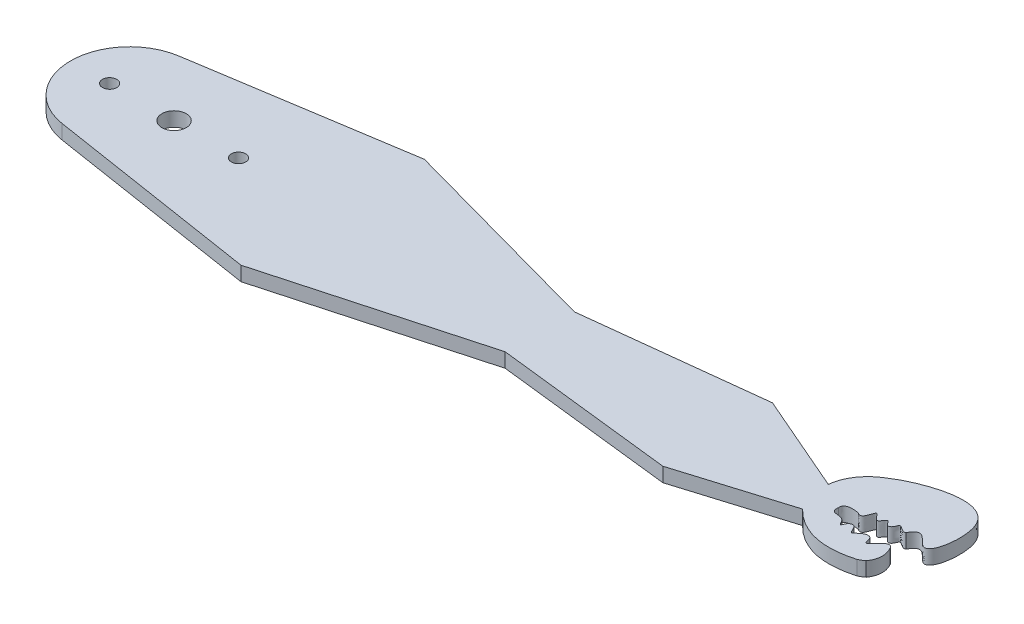
ISO-10303-21;
HEADER;
FILE_DESCRIPTION(('STEP AP214'),'2;1');
FILE_NAME('part.step','',(''),(''),'','','');
FILE_SCHEMA(('AUTOMOTIVE_DESIGN { 1 0 10303 214 1 1 1 1 }'));
ENDSEC;
DATA;
#1=APPLICATION_CONTEXT('core data for automotive mechanical design processes');
#2=APPLICATION_PROTOCOL_DEFINITION('international standard','automotive_design',2000,#1);
#3=PRODUCT_CONTEXT('',#1,'mechanical');
#4=PRODUCT('Part','Part','',(#3));
#5=PRODUCT_RELATED_PRODUCT_CATEGORY('part','',(#4));
#6=PRODUCT_DEFINITION_FORMATION('','',#4);
#7=PRODUCT_DEFINITION_CONTEXT('part definition',#1,'design');
#8=PRODUCT_DEFINITION('design','',#6,#7);
#9=PRODUCT_DEFINITION_SHAPE('','',#8);
#10=(LENGTH_UNIT() NAMED_UNIT(*) SI_UNIT(.MILLI.,.METRE.));
#11=(NAMED_UNIT(*) PLANE_ANGLE_UNIT() SI_UNIT($,.RADIAN.));
#12=(NAMED_UNIT(*) SI_UNIT($,.STERADIAN.) SOLID_ANGLE_UNIT());
#13=UNCERTAINTY_MEASURE_WITH_UNIT(LENGTH_MEASURE(1.E-05),#10,'distance_accuracy_value','');
#14=(GEOMETRIC_REPRESENTATION_CONTEXT(3) GLOBAL_UNCERTAINTY_ASSIGNED_CONTEXT((#13)) GLOBAL_UNIT_ASSIGNED_CONTEXT((#10,
#11,#12)) REPRESENTATION_CONTEXT('',''));
#15=CARTESIAN_POINT('',(0.,0.,0.));
#16=DIRECTION('',(0.,0.,1.));
#17=DIRECTION('',(1.,0.,0.));
#18=AXIS2_PLACEMENT_3D('',#15,#16,#17);
#19=CARTESIAN_POINT('',(-348.757842153945,2.,3.37769699555757E-05));
#20=DIRECTION('',(0.,-1.,0.));
#21=DIRECTION('',(0.,0.,-1.));
#22=AXIS2_PLACEMENT_3D('',#19,#20,#21);
#23=PLANE('',#22);
#24=DIRECTION('',(-0.987925316816776,0.,0.154930850357418));
#25=VECTOR('',#24,1.);
#26=CARTESIAN_POINT('',(-320.399473127503,2.,-12.8060343484789));
#27=LINE('',#26,#25);
#28=CARTESIAN_POINT('',(-320.399473127503,2.,-12.8060343484789));
#29=VERTEX_POINT('',#28);
#30=CARTESIAN_POINT('',(-350.037238292093,2.,-8.15810795011669));
#31=VERTEX_POINT('',#30);
#32=EDGE_CURVE('E289',#29,#31,#27,.T.);
#33=ORIENTED_EDGE('',*,*,#32,.T.);
#34=CARTESIAN_POINT('',(-348.757842153945,2.,3.37769699555757E-05));
#35=DIRECTION('',(0.,1.,0.));
#36=DIRECTION('',(0.,0.,-1.));
#37=AXIS2_PLACEMENT_3D('',#34,#35,#36);
#38=CIRCLE('',#37,8.25785268199552);
#39=CARTESIAN_POINT('',(-350.037238295601,2.,8.158175503507));
#40=VERTEX_POINT('',#39);
#41=EDGE_CURVE('E131',#31,#40,#38,.T.);
#42=ORIENTED_EDGE('',*,*,#41,.T.);
#43=DIRECTION('',(0.987925316750166,0.,0.154930850782159));
#44=VECTOR('',#43,1.);
#45=CARTESIAN_POINT('',(-320.399451417004,2.,12.8061053202124));
#46=LINE('',#45,#44);
#47=CARTESIAN_POINT('',(-320.399451417004,2.,12.8061053202124));
#48=VERTEX_POINT('',#47);
#49=EDGE_CURVE('E346',#40,#48,#46,.T.);
#50=ORIENTED_EDGE('',*,*,#49,.T.);
#51=DIRECTION('',(0.964004919808415,0.,-0.265884400793223));
#52=VECTOR('',#51,1.);
#53=CARTESIAN_POINT('',(-320.399451417004,2.,12.8061053202124));
#54=LINE('',#53,#52);
#55=CARTESIAN_POINT('',(-291.479303822752,2.,4.82957329641572));
#56=VERTEX_POINT('',#55);
#57=EDGE_CURVE('E366',#48,#56,#54,.T.);
#58=ORIENTED_EDGE('',*,*,#57,.T.);
#59=DIRECTION('',(0.993571298409724,0.,0.113208104729366));
#60=VECTOR('',#59,1.);
#61=CARTESIAN_POINT('',(-291.479303822752,2.,4.82957329641572));
#62=LINE('',#61,#60);
#63=CARTESIAN_POINT('',(-266.640021362509,2.,7.65977591464987));
#64=VERTEX_POINT('',#63);
#65=EDGE_CURVE('E362',#56,#64,#62,.T.);
#66=ORIENTED_EDGE('',*,*,#65,.T.);
#67=DIRECTION('',(0.956276851071863,0.,-0.292462961935494));
#68=VECTOR('',#67,1.);
#69=CARTESIAN_POINT('',(-266.640021362509,2.,7.65977591464987));
#70=LINE('',#69,#68);
#71=CARTESIAN_POINT('',(-251.696075381663,2.,3.0893937082174));
#72=VERTEX_POINT('',#71);
#73=EDGE_CURVE('E365',#64,#72,#70,.T.);
#74=ORIENTED_EDGE('',*,*,#73,.T.);
#75=CARTESIAN_POINT('',(-251.696075381663,2.,3.0893937082174));
#76=CARTESIAN_POINT('',(-249.084673797282,2.,5.74956122092215));
#77=CARTESIAN_POINT('',(-245.793192426089,2.,6.51151581306675));
#78=CARTESIAN_POINT('',(-241.821631268076,2.,5.3752574846623));
#79=B_SPLINE_CURVE_WITH_KNOTS('',3,(#75,#76,#77,#78),.UNSPECIFIED.,.F.,.F.,(4,4),
(0.135882265254511,1.),.UNSPECIFIED.);
#80=CARTESIAN_POINT('',(-241.821631268076,2.,5.3752574846623));
#81=VERTEX_POINT('',#80);
#82=EDGE_CURVE('E370',#72,#81,#79,.T.);
#83=ORIENTED_EDGE('',*,*,#82,.T.);
#84=CARTESIAN_POINT('',(-241.821631268076,2.,5.3752574846623));
#85=CARTESIAN_POINT('',(-241.643156571101,2.,5.30938942275893));
#86=CARTESIAN_POINT('',(-241.312545454973,2.,5.12610139004425));
#87=CARTESIAN_POINT('',(-240.997103543056,2.,4.89134270831965));
#88=B_SPLINE_CURVE_WITH_KNOTS('',3,(#84,#85,#86,#87),.UNSPECIFIED.,.F.,.F.,(4,4),(0.,
0.02362828678923),.UNSPECIFIED.);
#89=CARTESIAN_POINT('',(-240.997103543056,2.,4.89134270831965));
#90=VERTEX_POINT('',#89);
#91=EDGE_CURVE('E380',#81,#90,#88,.T.);
#92=ORIENTED_EDGE('',*,*,#91,.T.);
#93=CARTESIAN_POINT('',(-240.997103543056,2.,4.89134270831965));
#94=CARTESIAN_POINT('',(-239.966931466718,2.,3.3919956546017));
#95=CARTESIAN_POINT('',(-240.807899842543,2.,1.80035497286702));
#96=B_SPLINE_CURVE_WITH_KNOTS('',2,(#93,#94,#95),.UNSPECIFIED.,.F.,.F.,(3,3),(0.,1.),.UNSPECIFIED.);
#97=CARTESIAN_POINT('',(-240.807899842543,2.,1.80035497286702));
#98=VERTEX_POINT('',#97);
#99=EDGE_CURVE('E483',#90,#98,#96,.T.);
#100=ORIENTED_EDGE('',*,*,#99,.T.);
#101=CARTESIAN_POINT('',(-240.807899842543,2.,1.80035497286702));
#102=CARTESIAN_POINT('',(-241.169388438192,2.,0.960781139971008));
#103=CARTESIAN_POINT('',(-242.224201897098,2.,1.79730105291746));
#104=CARTESIAN_POINT('',(-243.326864122491,2.,3.26250414115986));
#105=CARTESIAN_POINT('',(-243.355713317097,2.,1.41657102157932));
#106=CARTESIAN_POINT('',(-244.720985899886,2.,1.80283182974819));
#107=CARTESIAN_POINT('',(-245.566979662435,2.,2.99073808183036));
#108=CARTESIAN_POINT('',(-245.789823544608,2.,1.29216414937665));
#109=CARTESIAN_POINT('',(-246.900381914562,2.,1.54538714498599));
#110=CARTESIAN_POINT('',(-247.112423771091,2.,2.73891734044677));
#111=CARTESIAN_POINT('',(-247.835383275373,2.,0.67903752686017));
#112=CARTESIAN_POINT('',(-249.515917865718,2.,1.8046076814795));
#113=CARTESIAN_POINT('',(-249.357187857252,2.,0.418676387322684));
#114=B_SPLINE_CURVE_WITH_KNOTS('',3,(#101,#102,#103,#104,#105,#106,#107,#108,#109,#110,#111,
#112,#113),.UNSPECIFIED.,.F.,.F.,(4,1,1,1,1,1,1,1,1,1,4),(0.,0.123556648661189,
0.228196390921648,0.303500384813847,0.412774636713077,0.476101668210691,0.57889698132745,
0.637988069442556,0.69972640040586,0.766366397499155,0.967687022896239),.UNSPECIFIED.);
#115=CARTESIAN_POINT('',(-249.357187857252,2.,0.418676387322684));
#116=VERTEX_POINT('',#115);
#117=EDGE_CURVE('E478',#98,#116,#114,.T.);
#118=ORIENTED_EDGE('',*,*,#117,.T.);
#119=CARTESIAN_POINT('',(-249.357187857252,2.,0.418676387322684));
#120=CARTESIAN_POINT('',(-249.530180599727,2.,-0.685883331463889));
#121=CARTESIAN_POINT('',(-247.707130946464,2.,-0.437949002432994));
#122=CARTESIAN_POINT('',(-247.311242473336,2.,-0.323468446235829));
#123=B_SPLINE_CURVE_WITH_KNOTS('',3,(#119,#120,#121,#122),.UNSPECIFIED.,.F.,.F.,(4,4),(0.,1.),.UNSPECIFIED.);
#124=CARTESIAN_POINT('',(-247.311242473336,2.,-0.323468446235828));
#125=VERTEX_POINT('',#124);
#126=EDGE_CURVE('E458',#116,#125,#123,.T.);
#127=ORIENTED_EDGE('',*,*,#126,.T.);
#128=CARTESIAN_POINT('',(-247.311242473336,2.,-0.323468446235828));
#129=CARTESIAN_POINT('',(-246.33439805527,2.,0.367123123334603));
#130=CARTESIAN_POINT('',(-246.354001067211,2.,-2.86824148141712));
#131=CARTESIAN_POINT('',(-245.089398938824,2.,-0.00407196348444178));
#132=CARTESIAN_POINT('',(-244.368676704118,2.,-2.04976444702337));
#133=CARTESIAN_POINT('',(-243.857318798616,2.,-0.571314740493384));
#134=CARTESIAN_POINT('',(-243.120868983887,2.,-1.09831473240628));
#135=CARTESIAN_POINT('',(-242.951073850223,2.,-2.14130011409426));
#136=CARTESIAN_POINT('',(-242.133814553318,2.,-1.11688843770171));
#137=CARTESIAN_POINT('',(-241.681380628757,2.,-1.24551456300629));
#138=CARTESIAN_POINT('',(-241.615045555612,2.,-1.27908511046874));
#139=B_SPLINE_CURVE_WITH_KNOTS('',3,(#128,#129,#130,#131,#132,#133,#134,#135,#136,#137,#138),
.UNSPECIFIED.,.F.,.F.,(4,1,1,1,1,1,1,1,4),(0.107490650731327,0.340171363528712,
0.480072762173064,0.596176515719199,0.698135384077689,0.764647112317775,0.837905578505877,
0.975006853942119,1.),.UNSPECIFIED.);
#140=CARTESIAN_POINT('',(-241.615045555612,2.,-1.27908511046874));
#141=VERTEX_POINT('',#140);
#142=EDGE_CURVE('E449',#125,#141,#139,.T.);
#143=ORIENTED_EDGE('',*,*,#142,.T.);
#144=CARTESIAN_POINT('',(-241.615045555612,2.,-1.27908511046874));
#145=CARTESIAN_POINT('',(-240.590240104387,2.,-3.34662219537973));
#146=CARTESIAN_POINT('',(-237.822398044967,2.,2.3526088443084));
#147=CARTESIAN_POINT('',(-235.338143074844,2.,-13.1849179381452));
#148=CARTESIAN_POINT('',(-247.192125326679,2.,-8.12223832573433));
#149=CARTESIAN_POINT('',(-249.182494927322,2.,-6.76830173694541));
#150=B_SPLINE_CURVE_WITH_KNOTS('',3,(#144,#145,#146,#147,#148,#149),.UNSPECIFIED.,.F.,.F.,(4,1,
1,4),(0.,0.159611963497581,0.435185754589667,1.),.UNSPECIFIED.);
#151=CARTESIAN_POINT('',(-249.182494927322,2.,-6.76830173694541));
#152=VERTEX_POINT('',#151);
#153=EDGE_CURVE('E440',#141,#152,#150,.T.);
#154=ORIENTED_EDGE('',*,*,#153,.T.);
#155=CARTESIAN_POINT('',(-249.182494927322,2.,-6.76830173694541));
#156=CARTESIAN_POINT('',(-251.139887534253,2.,-5.73572436099527));
#157=CARTESIAN_POINT('',(-252.664865396327,2.,-3.89659952658695));
#158=CARTESIAN_POINT('',(-252.877551864102,2.,-1.69364795863478));
#159=B_SPLINE_CURVE_WITH_KNOTS('',3,(#155,#156,#157,#158),.UNSPECIFIED.,.F.,.F.,(4,4),(0.,
0.432417622118642),.UNSPECIFIED.);
#160=CARTESIAN_POINT('',(-252.877551864102,2.,-1.69364795863478));
#161=VERTEX_POINT('',#160);
#162=EDGE_CURVE('E177',#152,#161,#159,.T.);
#163=ORIENTED_EDGE('',*,*,#162,.T.);
#164=DIRECTION('',(-0.917499414074508,0.,-0.397737130744584));
#165=VECTOR('',#164,1.);
#166=CARTESIAN_POINT('',(-266.64004307522,2.,-7.65970491980361));
#167=LINE('',#166,#165);
#168=CARTESIAN_POINT('',(-266.64004307522,2.,-7.65970491980361));
#169=VERTEX_POINT('',#168);
#170=EDGE_CURVE('E171',#161,#169,#167,.T.);
#171=ORIENTED_EDGE('',*,*,#170,.T.);
#172=DIRECTION('',(-0.993571298458396,0.,0.113208104302201));
#173=VECTOR('',#172,1.);
#174=CARTESIAN_POINT('',(-291.47932553668,2.,-4.82950231224858));
#175=LINE('',#174,#173);
#176=CARTESIAN_POINT('',(-291.47932553668,2.,-4.82950231224858));
#177=VERTEX_POINT('',#176);
#178=EDGE_CURVE('E175',#169,#177,#175,.T.);
#179=ORIENTED_EDGE('',*,*,#178,.T.);
#180=DIRECTION('',(-0.964004919694104,0.,-0.265884401207677));
#181=VECTOR('',#180,1.);
#182=CARTESIAN_POINT('',(-320.399473127503,2.,-12.8060343484789));
#183=LINE('',#182,#181);
#184=EDGE_CURVE('E61',#177,#29,#183,.T.);
#185=ORIENTED_EDGE('',*,*,#184,.T.);
#186=EDGE_LOOP('',(#33,#42,#50,#58,#66,#74,#83,#92,#100,#118,#127,#143,#154,#163,#171,#179,#185));
#187=FACE_BOUND('',#186,.T.);
#188=CARTESIAN_POINT('',(-351.550226025643,2.,0.));
#189=DIRECTION('',(0.,1.,0.));
#190=DIRECTION('',(0.,0.,1.));
#191=AXIS2_PLACEMENT_3D('',#188,#189,#190);
#192=CIRCLE('',#191,0.999999999999998);
#193=CARTESIAN_POINT('',(-351.550226025643,2.,0.999999999999998));
#194=VERTEX_POINT('',#193);
#195=EDGE_CURVE('E204',#194,#194,#192,.T.);
#196=ORIENTED_EDGE('',*,*,#195,.F.);
#197=EDGE_LOOP('',(#196));
#198=FACE_BOUND('',#197,.T.);
#199=CARTESIAN_POINT('',(-342.550226025643,2.,0.));
#200=DIRECTION('',(0.,1.,0.));
#201=DIRECTION('',(0.,0.,1.));
#202=AXIS2_PLACEMENT_3D('',#199,#200,#201);
#203=CIRCLE('',#202,1.69999999999996);
#204=CARTESIAN_POINT('',(-342.550226025643,2.,1.69999999999996));
#205=VERTEX_POINT('',#204);
#206=EDGE_CURVE('E532',#205,#205,#203,.T.);
#207=ORIENTED_EDGE('',*,*,#206,.F.);
#208=EDGE_LOOP('',(#207));
#209=FACE_BOUND('',#208,.T.);
#210=CARTESIAN_POINT('',(-333.550226025643,2.,0.));
#211=DIRECTION('',(0.,1.,0.));
#212=DIRECTION('',(0.,0.,-1.));
#213=AXIS2_PLACEMENT_3D('',#210,#211,#212);
#214=CIRCLE('',#213,0.999999999999998);
#215=CARTESIAN_POINT('',(-333.550226025643,2.,-0.999999999999998));
#216=VERTEX_POINT('',#215);
#217=EDGE_CURVE('E540',#216,#216,#214,.T.);
#218=ORIENTED_EDGE('',*,*,#217,.F.);
#219=EDGE_LOOP('',(#218));
#220=FACE_BOUND('',#219,.T.);
#221=ADVANCED_FACE('F43',(#187,#198,#209,#220),#23,.F.);
#222=CARTESIAN_POINT('',(-348.757842153945,0.,3.37769699555757E-05));
#223=DIRECTION('',(0.,-1.,0.));
#224=DIRECTION('',(0.,0.,-1.));
#225=AXIS2_PLACEMENT_3D('',#222,#223,#224);
#226=PLANE('',#225);
#227=CARTESIAN_POINT('',(-342.550226025643,0.,0.));
#228=DIRECTION('',(0.,1.,0.));
#229=DIRECTION('',(0.,0.,1.));
#230=AXIS2_PLACEMENT_3D('',#227,#228,#229);
#231=CIRCLE('',#230,1.69999999999996);
#232=CARTESIAN_POINT('',(-342.550226025643,0.,1.69999999999996));
#233=VERTEX_POINT('',#232);
#234=EDGE_CURVE('E536',#233,#233,#231,.T.);
#235=ORIENTED_EDGE('',*,*,#234,.T.);
#236=EDGE_LOOP('',(#235));
#237=FACE_BOUND('',#236,.T.);
#238=DIRECTION('',(-0.987925316816776,0.,0.154930850357418));
#239=VECTOR('',#238,1.);
#240=CARTESIAN_POINT('',(-320.399473127503,0.,-12.8060343484789));
#241=LINE('',#240,#239);
#242=CARTESIAN_POINT('',(-320.399473127503,0.,-12.8060343484789));
#243=VERTEX_POINT('',#242);
#244=CARTESIAN_POINT('',(-350.037238292093,0.,-8.15810795011669));
#245=VERTEX_POINT('',#244);
#246=EDGE_CURVE('E199',#243,#245,#241,.T.);
#247=ORIENTED_EDGE('',*,*,#246,.F.);
#248=DIRECTION('',(-0.964004919694104,0.,-0.265884401207677));
#249=VECTOR('',#248,1.);
#250=CARTESIAN_POINT('',(-320.399473127503,0.,-12.8060343484789));
#251=LINE('',#250,#249);
#252=CARTESIAN_POINT('',(-291.47932553668,0.,-4.82950231224858));
#253=VERTEX_POINT('',#252);
#254=EDGE_CURVE('E123',#253,#243,#251,.T.);
#255=ORIENTED_EDGE('',*,*,#254,.F.);
#256=DIRECTION('',(-0.993571298458396,0.,0.113208104302201));
#257=VECTOR('',#256,1.);
#258=CARTESIAN_POINT('',(-291.47932553668,0.,-4.82950231224858));
#259=LINE('',#258,#257);
#260=CARTESIAN_POINT('',(-266.64004307522,0.,-7.65970491980361));
#261=VERTEX_POINT('',#260);
#262=EDGE_CURVE('E117',#261,#253,#259,.T.);
#263=ORIENTED_EDGE('',*,*,#262,.F.);
#264=DIRECTION('',(-0.917499414074508,0.,-0.397737130744584));
#265=VECTOR('',#264,1.);
#266=CARTESIAN_POINT('',(-266.64004307522,0.,-7.65970491980361));
#267=LINE('',#266,#265);
#268=CARTESIAN_POINT('',(-252.877551864102,0.,-1.69364795863478));
#269=VERTEX_POINT('',#268);
#270=EDGE_CURVE('E186',#269,#261,#267,.T.);
#271=ORIENTED_EDGE('',*,*,#270,.F.);
#272=CARTESIAN_POINT('',(-249.182494927322,0.,-6.76830173694541));
#273=CARTESIAN_POINT('',(-251.139887534253,0.,-5.73572436099527));
#274=CARTESIAN_POINT('',(-252.664865396327,0.,-3.89659952658695));
#275=CARTESIAN_POINT('',(-252.877551864102,0.,-1.69364795863478));
#276=B_SPLINE_CURVE_WITH_KNOTS('',3,(#272,#273,#274,#275),.UNSPECIFIED.,.F.,.F.,(4,4),(0.,
0.432417622118642),.UNSPECIFIED.);
#277=CARTESIAN_POINT('',(-249.182494927322,0.,-6.76830173694541));
#278=VERTEX_POINT('',#277);
#279=EDGE_CURVE('E272',#278,#269,#276,.T.);
#280=ORIENTED_EDGE('',*,*,#279,.F.);
#281=CARTESIAN_POINT('',(-241.615045555612,0.,-1.27908511046874));
#282=CARTESIAN_POINT('',(-240.590240104387,0.,-3.34662219537973));
#283=CARTESIAN_POINT('',(-237.822398044967,0.,2.3526088443084));
#284=CARTESIAN_POINT('',(-235.338143074844,0.,-13.1849179381452));
#285=CARTESIAN_POINT('',(-247.192125326679,0.,-8.12223832573433));
#286=CARTESIAN_POINT('',(-249.182494927322,0.,-6.76830173694541));
#287=B_SPLINE_CURVE_WITH_KNOTS('',3,(#281,#282,#283,#284,#285,#286),.UNSPECIFIED.,.F.,.F.,(4,1,
1,4),(0.,0.159611963497581,0.435185754589667,1.),.UNSPECIFIED.);
#288=CARTESIAN_POINT('',(-241.615045555612,0.,-1.27908511046874));
#289=VERTEX_POINT('',#288);
#290=EDGE_CURVE('E264',#289,#278,#287,.T.);
#291=ORIENTED_EDGE('',*,*,#290,.F.);
#292=CARTESIAN_POINT('',(-247.311242473336,0.,-0.323468446235828));
#293=CARTESIAN_POINT('',(-246.33439805527,0.,0.367123123334603));
#294=CARTESIAN_POINT('',(-246.354001067211,0.,-2.86824148141712));
#295=CARTESIAN_POINT('',(-245.089398938824,0.,-0.00407196348444178));
#296=CARTESIAN_POINT('',(-244.368676704118,0.,-2.04976444702337));
#297=CARTESIAN_POINT('',(-243.857318798616,0.,-0.571314740493384));
#298=CARTESIAN_POINT('',(-243.120868983887,0.,-1.09831473240628));
#299=CARTESIAN_POINT('',(-242.951073850223,0.,-2.14130011409426));
#300=CARTESIAN_POINT('',(-242.133814553318,0.,-1.11688843770171));
#301=CARTESIAN_POINT('',(-241.681380628757,0.,-1.24551456300629));
#302=CARTESIAN_POINT('',(-241.615045555612,0.,-1.27908511046874));
#303=B_SPLINE_CURVE_WITH_KNOTS('',3,(#292,#293,#294,#295,#296,#297,#298,#299,#300,#301,#302),
.UNSPECIFIED.,.F.,.F.,(4,1,1,1,1,1,1,1,4),(0.107490650731327,0.340171363528712,
0.480072762173064,0.596176515719199,0.698135384077689,0.764647112317775,0.837905578505877,
0.975006853942119,1.),.UNSPECIFIED.);
#304=CARTESIAN_POINT('',(-247.311242473336,0.,-0.323468446235828));
#305=VERTEX_POINT('',#304);
#306=EDGE_CURVE('E256',#305,#289,#303,.T.);
#307=ORIENTED_EDGE('',*,*,#306,.F.);
#308=CARTESIAN_POINT('',(-249.357187857252,0.,0.418676387322684));
#309=CARTESIAN_POINT('',(-249.530180599727,0.,-0.685883331463889));
#310=CARTESIAN_POINT('',(-247.707130946464,0.,-0.437949002432994));
#311=CARTESIAN_POINT('',(-247.311242473336,0.,-0.323468446235829));
#312=B_SPLINE_CURVE_WITH_KNOTS('',3,(#308,#309,#310,#311),.UNSPECIFIED.,.F.,.F.,(4,4),(0.,1.),.UNSPECIFIED.);
#313=CARTESIAN_POINT('',(-249.357187857252,0.,0.418676387322684));
#314=VERTEX_POINT('',#313);
#315=EDGE_CURVE('E248',#314,#305,#312,.T.);
#316=ORIENTED_EDGE('',*,*,#315,.F.);
#317=CARTESIAN_POINT('',(-240.807899842543,0.,1.80035497286702));
#318=CARTESIAN_POINT('',(-241.169388438192,0.,0.960781139971008));
#319=CARTESIAN_POINT('',(-242.224201897098,0.,1.79730105291746));
#320=CARTESIAN_POINT('',(-243.326864122491,0.,3.26250414115986));
#321=CARTESIAN_POINT('',(-243.355713317097,0.,1.41657102157932));
#322=CARTESIAN_POINT('',(-244.720985899886,0.,1.80283182974819));
#323=CARTESIAN_POINT('',(-245.566979662435,0.,2.99073808183036));
#324=CARTESIAN_POINT('',(-245.789823544608,0.,1.29216414937665));
#325=CARTESIAN_POINT('',(-246.900381914562,0.,1.54538714498599));
#326=CARTESIAN_POINT('',(-247.112423771091,0.,2.73891734044677));
#327=CARTESIAN_POINT('',(-247.835383275373,0.,0.67903752686017));
#328=CARTESIAN_POINT('',(-249.515917865718,0.,1.8046076814795));
#329=CARTESIAN_POINT('',(-249.357187857252,0.,0.418676387322684));
#330=B_SPLINE_CURVE_WITH_KNOTS('',3,(#317,#318,#319,#320,#321,#322,#323,#324,#325,#326,#327,
#328,#329),.UNSPECIFIED.,.F.,.F.,(4,1,1,1,1,1,1,1,1,1,4),(0.,0.123556648661189,
0.228196390921648,0.303500384813847,0.412774636713077,0.476101668210691,0.57889698132745,
0.637988069442556,0.69972640040586,0.766366397499155,0.967687022896239),.UNSPECIFIED.);
#331=CARTESIAN_POINT('',(-240.807899842543,0.,1.80035497286702));
#332=VERTEX_POINT('',#331);
#333=EDGE_CURVE('E240',#332,#314,#330,.T.);
#334=ORIENTED_EDGE('',*,*,#333,.F.);
#335=CARTESIAN_POINT('',(-240.997103543056,0.,4.89134270831965));
#336=CARTESIAN_POINT('',(-239.966931466718,0.,3.3919956546017));
#337=CARTESIAN_POINT('',(-240.807899842543,0.,1.80035497286702));
#338=B_SPLINE_CURVE_WITH_KNOTS('',2,(#335,#336,#337),.UNSPECIFIED.,.F.,.F.,(3,3),(0.,1.),.UNSPECIFIED.);
#339=CARTESIAN_POINT('',(-240.997103543056,0.,4.89134270831965));
#340=VERTEX_POINT('',#339);
#341=EDGE_CURVE('E232',#340,#332,#338,.T.);
#342=ORIENTED_EDGE('',*,*,#341,.F.);
#343=CARTESIAN_POINT('',(-241.821631268076,0.,5.3752574846623));
#344=CARTESIAN_POINT('',(-241.643156571101,0.,5.30938942275893));
#345=CARTESIAN_POINT('',(-241.312545454973,0.,5.12610139004425));
#346=CARTESIAN_POINT('',(-240.997103543056,0.,4.89134270831965));
#347=B_SPLINE_CURVE_WITH_KNOTS('',3,(#343,#344,#345,#346),.UNSPECIFIED.,.F.,.F.,(4,4),(0.,
0.02362828678923),.UNSPECIFIED.);
#348=CARTESIAN_POINT('',(-241.821631268076,0.,5.3752574846623));
#349=VERTEX_POINT('',#348);
#350=EDGE_CURVE('E224',#349,#340,#347,.T.);
#351=ORIENTED_EDGE('',*,*,#350,.F.);
#352=CARTESIAN_POINT('',(-251.696075381663,0.,3.0893937082174));
#353=CARTESIAN_POINT('',(-249.084673797282,0.,5.74956122092215));
#354=CARTESIAN_POINT('',(-245.793192426089,0.,6.51151581306675));
#355=CARTESIAN_POINT('',(-241.821631268076,0.,5.3752574846623));
#356=B_SPLINE_CURVE_WITH_KNOTS('',3,(#352,#353,#354,#355),.UNSPECIFIED.,.F.,.F.,(4,4),
(0.135882265254511,1.),.UNSPECIFIED.);
#357=CARTESIAN_POINT('',(-251.696075381663,0.,3.0893937082174));
#358=VERTEX_POINT('',#357);
#359=EDGE_CURVE('E219',#358,#349,#356,.T.);
#360=ORIENTED_EDGE('',*,*,#359,.F.);
#361=DIRECTION('',(0.956276851071863,0.,-0.292462961935494));
#362=VECTOR('',#361,1.);
#363=CARTESIAN_POINT('',(-266.640021362509,0.,7.65977591464987));
#364=LINE('',#363,#362);
#365=CARTESIAN_POINT('',(-266.640021362509,0.,7.65977591464987));
#366=VERTEX_POINT('',#365);
#367=EDGE_CURVE('E216',#366,#358,#364,.T.);
#368=ORIENTED_EDGE('',*,*,#367,.F.);
#369=DIRECTION('',(0.993571298409724,0.,0.113208104729366));
#370=VECTOR('',#369,1.);
#371=CARTESIAN_POINT('',(-291.479303822752,0.,4.82957329641572));
#372=LINE('',#371,#370);
#373=CARTESIAN_POINT('',(-291.479303822752,0.,4.82957329641572));
#374=VERTEX_POINT('',#373);
#375=EDGE_CURVE('E213',#374,#366,#372,.T.);
#376=ORIENTED_EDGE('',*,*,#375,.F.);
#377=DIRECTION('',(0.964004919808415,0.,-0.265884400793223));
#378=VECTOR('',#377,1.);
#379=CARTESIAN_POINT('',(-320.399451417004,0.,12.8061053202124));
#380=LINE('',#379,#378);
#381=CARTESIAN_POINT('',(-320.399451417004,0.,12.8061053202124));
#382=VERTEX_POINT('',#381);
#383=EDGE_CURVE('E210',#382,#374,#380,.T.);
#384=ORIENTED_EDGE('',*,*,#383,.F.);
#385=DIRECTION('',(0.987925316750166,0.,0.154930850782159));
#386=VECTOR('',#385,1.);
#387=CARTESIAN_POINT('',(-320.399451417004,0.,12.8061053202124));
#388=LINE('',#387,#386);
#389=CARTESIAN_POINT('',(-350.037238295601,0.,8.158175503507));
#390=VERTEX_POINT('',#389);
#391=EDGE_CURVE('E207',#390,#382,#388,.T.);
#392=ORIENTED_EDGE('',*,*,#391,.F.);
#393=CARTESIAN_POINT('',(-348.757842153945,0.,3.37769699555757E-05));
#394=DIRECTION('',(0.,1.,0.));
#395=DIRECTION('',(0.,0.,-1.));
#396=AXIS2_PLACEMENT_3D('',#393,#394,#395);
#397=CIRCLE('',#396,8.25785268199552);
#398=EDGE_CURVE('E203',#245,#390,#397,.T.);
#399=ORIENTED_EDGE('',*,*,#398,.F.);
#400=EDGE_LOOP('',(#247,#255,#263,#271,#280,#291,#307,#316,#334,#342,#351,#360,#368,#376,#384,
#392,#399));
#401=FACE_BOUND('',#400,.T.);
#402=CARTESIAN_POINT('',(-351.550226025643,0.,0.));
#403=DIRECTION('',(0.,1.,0.));
#404=DIRECTION('',(0.,0.,1.));
#405=AXIS2_PLACEMENT_3D('',#402,#403,#404);
#406=CIRCLE('',#405,0.999999999999998);
#407=CARTESIAN_POINT('',(-351.550226025643,0.,0.999999999999998));
#408=VERTEX_POINT('',#407);
#409=EDGE_CURVE('E527',#408,#408,#406,.T.);
#410=ORIENTED_EDGE('',*,*,#409,.T.);
#411=EDGE_LOOP('',(#410));
#412=FACE_BOUND('',#411,.T.);
#413=CARTESIAN_POINT('',(-333.550226025643,0.,0.));
#414=DIRECTION('',(0.,1.,0.));
#415=DIRECTION('',(0.,0.,-1.));
#416=AXIS2_PLACEMENT_3D('',#413,#414,#415);
#417=CIRCLE('',#416,0.999999999999998);
#418=CARTESIAN_POINT('',(-333.550226025643,0.,-0.999999999999998));
#419=VERTEX_POINT('',#418);
#420=EDGE_CURVE('E544',#419,#419,#417,.T.);
#421=ORIENTED_EDGE('',*,*,#420,.T.);
#422=EDGE_LOOP('',(#421));
#423=FACE_BOUND('',#422,.T.);
#424=ADVANCED_FACE('F350',(#237,#401,#412,#423),#226,.T.);
#425=CARTESIAN_POINT('',(-320.399473127503,2.,-12.8060343484789));
#426=DIRECTION('',(0.154930850357418,0.,0.987925316816776));
#427=DIRECTION('',(0.987925316816776,0.,-0.154930850357418));
#428=AXIS2_PLACEMENT_3D('',#425,#426,#427);
#429=PLANE('',#428);
#430=ORIENTED_EDGE('',*,*,#246,.T.);
#431=DIRECTION('',(0.,-1.,0.));
#432=VECTOR('',#431,1.);
#433=CARTESIAN_POINT('',(-350.037238292093,2.,-8.15810795011669));
#434=LINE('',#433,#432);
#435=EDGE_CURVE('E11',#31,#245,#434,.T.);
#436=ORIENTED_EDGE('',*,*,#435,.F.);
#437=ORIENTED_EDGE('',*,*,#32,.F.);
#438=DIRECTION('',(0.,-1.,0.));
#439=VECTOR('',#438,1.);
#440=CARTESIAN_POINT('',(-320.399473127503,2.,-12.8060343484789));
#441=LINE('',#440,#439);
#442=EDGE_CURVE('E195',#29,#243,#441,.T.);
#443=ORIENTED_EDGE('',*,*,#442,.T.);
#444=EDGE_LOOP('',(#430,#436,#437,#443));
#445=FACE_BOUND('',#444,.T.);
#446=ADVANCED_FACE('F45',(#445),#429,.F.);
#447=CARTESIAN_POINT('',(-348.757842153945,2.,3.37769699555757E-05));
#448=DIRECTION('',(0.,-1.,0.));
#449=DIRECTION('',(0.,0.,-1.));
#450=AXIS2_PLACEMENT_3D('',#447,#448,#449);
#451=CYLINDRICAL_SURFACE('',#450,8.25785268199552);
#452=ORIENTED_EDGE('',*,*,#398,.T.);
#453=DIRECTION('',(0.,-1.,0.));
#454=VECTOR('',#453,1.);
#455=CARTESIAN_POINT('',(-350.037238295601,2.,8.158175503507));
#456=LINE('',#455,#454);
#457=EDGE_CURVE('E53',#40,#390,#456,.T.);
#458=ORIENTED_EDGE('',*,*,#457,.F.);
#459=ORIENTED_EDGE('',*,*,#41,.F.);
#460=ORIENTED_EDGE('',*,*,#435,.T.);
#461=EDGE_LOOP('',(#452,#458,#459,#460));
#462=FACE_BOUND('',#461,.T.);
#463=ADVANCED_FACE('F405',(#462),#451,.T.);
#464=CARTESIAN_POINT('',(-320.399451417004,2.,12.8061053202124));
#465=DIRECTION('',(0.154930850782159,0.,-0.987925316750166));
#466=DIRECTION('',(-0.987925316750166,0.,-0.154930850782159));
#467=AXIS2_PLACEMENT_3D('',#464,#465,#466);
#468=PLANE('',#467);
#469=ORIENTED_EDGE('',*,*,#391,.T.);
#470=DIRECTION('',(0.,-1.,0.));
#471=VECTOR('',#470,1.);
#472=CARTESIAN_POINT('',(-320.399451417004,2.,12.8061053202124));
#473=LINE('',#472,#471);
#474=EDGE_CURVE('E336',#48,#382,#473,.T.);
#475=ORIENTED_EDGE('',*,*,#474,.F.);
#476=ORIENTED_EDGE('',*,*,#49,.F.);
#477=ORIENTED_EDGE('',*,*,#457,.T.);
#478=EDGE_LOOP('',(#469,#475,#476,#477));
#479=FACE_BOUND('',#478,.T.);
#480=ADVANCED_FACE('F344',(#479),#468,.F.);
#481=CARTESIAN_POINT('',(-320.399451417004,2.,12.8061053202124));
#482=DIRECTION('',(-0.265884400793223,0.,-0.964004919808415));
#483=DIRECTION('',(-0.964004919808415,0.,0.265884400793223));
#484=AXIS2_PLACEMENT_3D('',#481,#482,#483);
#485=PLANE('',#484);
#486=ORIENTED_EDGE('',*,*,#383,.T.);
#487=DIRECTION('',(0.,-1.,0.));
#488=VECTOR('',#487,1.);
#489=CARTESIAN_POINT('',(-291.479303822752,2.,4.82957329641572));
#490=LINE('',#489,#488);
#491=EDGE_CURVE('E332',#56,#374,#490,.T.);
#492=ORIENTED_EDGE('',*,*,#491,.F.);
#493=ORIENTED_EDGE('',*,*,#57,.F.);
#494=ORIENTED_EDGE('',*,*,#474,.T.);
#495=EDGE_LOOP('',(#486,#492,#493,#494));
#496=FACE_BOUND('',#495,.T.);
#497=ADVANCED_FACE('F356',(#496),#485,.F.);
#498=CARTESIAN_POINT('',(-291.479303822752,2.,4.82957329641572));
#499=DIRECTION('',(0.113208104729366,0.,-0.993571298409724));
#500=DIRECTION('',(-0.993571298409724,0.,-0.113208104729366));
#501=AXIS2_PLACEMENT_3D('',#498,#499,#500);
#502=PLANE('',#501);
#503=ORIENTED_EDGE('',*,*,#375,.T.);
#504=DIRECTION('',(0.,-1.,0.));
#505=VECTOR('',#504,1.);
#506=CARTESIAN_POINT('',(-266.640021362509,2.,7.65977591464987));
#507=LINE('',#506,#505);
#508=EDGE_CURVE('E328',#64,#366,#507,.T.);
#509=ORIENTED_EDGE('',*,*,#508,.F.);
#510=ORIENTED_EDGE('',*,*,#65,.F.);
#511=ORIENTED_EDGE('',*,*,#491,.T.);
#512=EDGE_LOOP('',(#503,#509,#510,#511));
#513=FACE_BOUND('',#512,.T.);
#514=ADVANCED_FACE('F360',(#513),#502,.F.);
#515=CARTESIAN_POINT('',(-266.640021362509,2.,7.65977591464987));
#516=DIRECTION('',(-0.292462961935494,0.,-0.956276851071863));
#517=DIRECTION('',(-0.956276851071863,0.,0.292462961935494));
#518=AXIS2_PLACEMENT_3D('',#515,#516,#517);
#519=PLANE('',#518);
#520=ORIENTED_EDGE('',*,*,#367,.T.);
#521=DIRECTION('',(0.,-1.,0.));
#522=VECTOR('',#521,1.);
#523=CARTESIAN_POINT('',(-251.696075381663,2.,3.0893937082174));
#524=LINE('',#523,#522);
#525=EDGE_CURVE('E324',#72,#358,#524,.T.);
#526=ORIENTED_EDGE('',*,*,#525,.F.);
#527=ORIENTED_EDGE('',*,*,#73,.F.);
#528=ORIENTED_EDGE('',*,*,#508,.T.);
#529=EDGE_LOOP('',(#520,#526,#527,#528));
#530=FACE_BOUND('',#529,.T.);
#531=ADVANCED_FACE('F394',(#530),#519,.F.);
#532=DIRECTION('',(0.,-1.,0.));
#533=VECTOR('',#532,1.);
#534=SURFACE_OF_LINEAR_EXTRUSION('',#79,#533);
#535=ORIENTED_EDGE('',*,*,#359,.T.);
#536=DIRECTION('',(0.,-1.,0.));
#537=VECTOR('',#536,1.);
#538=CARTESIAN_POINT('',(-241.821631268076,2.,5.3752574846623));
#539=LINE('',#538,#537);
#540=EDGE_CURVE('E320',#81,#349,#539,.T.);
#541=ORIENTED_EDGE('',*,*,#540,.F.);
#542=ORIENTED_EDGE('',*,*,#82,.F.);
#543=ORIENTED_EDGE('',*,*,#525,.T.);
#544=EDGE_LOOP('',(#535,#541,#542,#543));
#545=FACE_BOUND('',#544,.T.);
#546=ADVANCED_FACE('F389',(#545),#534,.F.);
#547=DIRECTION('',(0.,-1.,0.));
#548=VECTOR('',#547,1.);
#549=SURFACE_OF_LINEAR_EXTRUSION('',#88,#548);
#550=ORIENTED_EDGE('',*,*,#350,.T.);
#551=DIRECTION('',(0.,-1.,0.));
#552=VECTOR('',#551,1.);
#553=CARTESIAN_POINT('',(-240.997103543056,2.,4.89134270831965));
#554=LINE('',#553,#552);
#555=EDGE_CURVE('E316',#90,#340,#554,.T.);
#556=ORIENTED_EDGE('',*,*,#555,.F.);
#557=ORIENTED_EDGE('',*,*,#91,.F.);
#558=ORIENTED_EDGE('',*,*,#540,.T.);
#559=EDGE_LOOP('',(#550,#556,#557,#558));
#560=FACE_BOUND('',#559,.T.);
#561=ADVANCED_FACE('F393',(#560),#549,.F.);
#562=DIRECTION('',(0.,-1.,0.));
#563=VECTOR('',#562,1.);
#564=SURFACE_OF_LINEAR_EXTRUSION('',#96,#563);
#565=ORIENTED_EDGE('',*,*,#341,.T.);
#566=DIRECTION('',(0.,-1.,0.));
#567=VECTOR('',#566,1.);
#568=CARTESIAN_POINT('',(-240.807899842543,2.,1.80035497286702));
#569=LINE('',#568,#567);
#570=EDGE_CURVE('E312',#98,#332,#569,.T.);
#571=ORIENTED_EDGE('',*,*,#570,.F.);
#572=ORIENTED_EDGE('',*,*,#99,.F.);
#573=ORIENTED_EDGE('',*,*,#555,.T.);
#574=EDGE_LOOP('',(#565,#571,#572,#573));
#575=FACE_BOUND('',#574,.T.);
#576=ADVANCED_FACE('F476',(#575),#564,.F.);
#577=DIRECTION('',(0.,-1.,0.));
#578=VECTOR('',#577,1.);
#579=SURFACE_OF_LINEAR_EXTRUSION('',#114,#578);
#580=ORIENTED_EDGE('',*,*,#333,.T.);
#581=DIRECTION('',(0.,-1.,0.));
#582=VECTOR('',#581,1.);
#583=CARTESIAN_POINT('',(-249.357187857252,2.,0.418676387322684));
#584=LINE('',#583,#582);
#585=EDGE_CURVE('E308',#116,#314,#584,.T.);
#586=ORIENTED_EDGE('',*,*,#585,.F.);
#587=ORIENTED_EDGE('',*,*,#117,.F.);
#588=ORIENTED_EDGE('',*,*,#570,.T.);
#589=EDGE_LOOP('',(#580,#586,#587,#588));
#590=FACE_BOUND('',#589,.T.);
#591=ADVANCED_FACE('F473',(#590),#579,.F.);
#592=DIRECTION('',(0.,-1.,0.));
#593=VECTOR('',#592,1.);
#594=SURFACE_OF_LINEAR_EXTRUSION('',#123,#593);
#595=ORIENTED_EDGE('',*,*,#315,.T.);
#596=DIRECTION('',(0.,-1.,0.));
#597=VECTOR('',#596,1.);
#598=CARTESIAN_POINT('',(-247.311242473336,2.,-0.323468446235828));
#599=LINE('',#598,#597);
#600=EDGE_CURVE('E304',#125,#305,#599,.T.);
#601=ORIENTED_EDGE('',*,*,#600,.F.);
#602=ORIENTED_EDGE('',*,*,#126,.F.);
#603=ORIENTED_EDGE('',*,*,#585,.T.);
#604=EDGE_LOOP('',(#595,#601,#602,#603));
#605=FACE_BOUND('',#604,.T.);
#606=ADVANCED_FACE('F469',(#605),#594,.F.);
#607=DIRECTION('',(0.,-1.,0.));
#608=VECTOR('',#607,1.);
#609=SURFACE_OF_LINEAR_EXTRUSION('',#139,#608);
#610=ORIENTED_EDGE('',*,*,#306,.T.);
#611=DIRECTION('',(0.,-1.,0.));
#612=VECTOR('',#611,1.);
#613=CARTESIAN_POINT('',(-241.615045555612,2.,-1.27908511046874));
#614=LINE('',#613,#612);
#615=EDGE_CURVE('E300',#141,#289,#614,.T.);
#616=ORIENTED_EDGE('',*,*,#615,.F.);
#617=ORIENTED_EDGE('',*,*,#142,.F.);
#618=ORIENTED_EDGE('',*,*,#600,.T.);
#619=EDGE_LOOP('',(#610,#616,#617,#618));
#620=FACE_BOUND('',#619,.T.);
#621=ADVANCED_FACE('F466',(#620),#609,.F.);
#622=DIRECTION('',(0.,-1.,0.));
#623=VECTOR('',#622,1.);
#624=SURFACE_OF_LINEAR_EXTRUSION('',#150,#623);
#625=ORIENTED_EDGE('',*,*,#290,.T.);
#626=DIRECTION('',(0.,-1.,0.));
#627=VECTOR('',#626,1.);
#628=CARTESIAN_POINT('',(-249.182494927322,2.,-6.76830173694541));
#629=LINE('',#628,#627);
#630=EDGE_CURVE('E296',#152,#278,#629,.T.);
#631=ORIENTED_EDGE('',*,*,#630,.F.);
#632=ORIENTED_EDGE('',*,*,#153,.F.);
#633=ORIENTED_EDGE('',*,*,#615,.T.);
#634=EDGE_LOOP('',(#625,#631,#632,#633));
#635=FACE_BOUND('',#634,.T.);
#636=ADVANCED_FACE('F432',(#635),#624,.F.);
#637=DIRECTION('',(0.,-1.,0.));
#638=VECTOR('',#637,1.);
#639=SURFACE_OF_LINEAR_EXTRUSION('',#159,#638);
#640=ORIENTED_EDGE('',*,*,#279,.T.);
#641=DIRECTION('',(0.,-1.,0.));
#642=VECTOR('',#641,1.);
#643=CARTESIAN_POINT('',(-252.877551864102,2.,-1.69364795863478));
#644=LINE('',#643,#642);
#645=EDGE_CURVE('E188',#161,#269,#644,.T.);
#646=ORIENTED_EDGE('',*,*,#645,.F.);
#647=ORIENTED_EDGE('',*,*,#162,.F.);
#648=ORIENTED_EDGE('',*,*,#630,.T.);
#649=EDGE_LOOP('',(#640,#646,#647,#648));
#650=FACE_BOUND('',#649,.T.);
#651=ADVANCED_FACE('F429',(#650),#639,.F.);
#652=CARTESIAN_POINT('',(-266.64004307522,2.,-7.65970491980361));
#653=DIRECTION('',(-0.397737130744584,0.,0.917499414074508));
#654=DIRECTION('',(0.917499414074508,0.,0.397737130744584));
#655=AXIS2_PLACEMENT_3D('',#652,#653,#654);
#656=PLANE('',#655);
#657=ORIENTED_EDGE('',*,*,#270,.T.);
#658=DIRECTION('',(0.,-1.,0.));
#659=VECTOR('',#658,1.);
#660=CARTESIAN_POINT('',(-266.64004307522,2.,-7.65970491980361));
#661=LINE('',#660,#659);
#662=EDGE_CURVE('E183',#169,#261,#661,.T.);
#663=ORIENTED_EDGE('',*,*,#662,.F.);
#664=ORIENTED_EDGE('',*,*,#170,.F.);
#665=ORIENTED_EDGE('',*,*,#645,.T.);
#666=EDGE_LOOP('',(#657,#663,#664,#665));
#667=FACE_BOUND('',#666,.T.);
#668=ADVANCED_FACE('F184',(#667),#656,.F.);
#669=CARTESIAN_POINT('',(-291.47932553668,2.,-4.82950231224858));
#670=DIRECTION('',(0.113208104302201,0.,0.993571298458396));
#671=DIRECTION('',(0.993571298458396,0.,-0.113208104302201));
#672=AXIS2_PLACEMENT_3D('',#669,#670,#671);
#673=PLANE('',#672);
#674=ORIENTED_EDGE('',*,*,#262,.T.);
#675=DIRECTION('',(0.,-1.,0.));
#676=VECTOR('',#675,1.);
#677=CARTESIAN_POINT('',(-291.47932553668,2.,-4.82950231224858));
#678=LINE('',#677,#676);
#679=EDGE_CURVE('E189',#177,#253,#678,.T.);
#680=ORIENTED_EDGE('',*,*,#679,.F.);
#681=ORIENTED_EDGE('',*,*,#178,.F.);
#682=ORIENTED_EDGE('',*,*,#662,.T.);
#683=EDGE_LOOP('',(#674,#680,#681,#682));
#684=FACE_BOUND('',#683,.T.);
#685=ADVANCED_FACE('F191',(#684),#673,.F.);
#686=CARTESIAN_POINT('',(-320.399473127503,2.,-12.8060343484789));
#687=DIRECTION('',(-0.265884401207677,0.,0.964004919694104));
#688=DIRECTION('',(0.964004919694104,0.,0.265884401207677));
#689=AXIS2_PLACEMENT_3D('',#686,#687,#688);
#690=PLANE('',#689);
#691=ORIENTED_EDGE('',*,*,#254,.T.);
#692=ORIENTED_EDGE('',*,*,#442,.F.);
#693=ORIENTED_EDGE('',*,*,#184,.F.);
#694=ORIENTED_EDGE('',*,*,#679,.T.);
#695=EDGE_LOOP('',(#691,#692,#693,#694));
#696=FACE_BOUND('',#695,.T.);
#697=ADVANCED_FACE('F422',(#696),#690,.F.);
#698=CARTESIAN_POINT('',(-351.550226025643,2.,0.));
#699=DIRECTION('',(0.,-1.,0.));
#700=DIRECTION('',(0.,0.,-1.));
#701=AXIS2_PLACEMENT_3D('',#698,#699,#700);
#702=CYLINDRICAL_SURFACE('',#701,0.999999999999998);
#703=ORIENTED_EDGE('',*,*,#195,.T.);
#704=EDGE_LOOP('',(#703));
#705=FACE_BOUND('',#704,.T.);
#706=ORIENTED_EDGE('',*,*,#409,.F.);
#707=EDGE_LOOP('',(#706));
#708=FACE_BOUND('',#707,.T.);
#709=ADVANCED_FACE('F419',(#705,#708),#702,.F.);
#710=CARTESIAN_POINT('',(-342.550226025643,2.,0.));
#711=DIRECTION('',(0.,-1.,0.));
#712=DIRECTION('',(0.,0.,-1.));
#713=AXIS2_PLACEMENT_3D('',#710,#711,#712);
#714=CYLINDRICAL_SURFACE('',#713,1.69999999999996);
#715=ORIENTED_EDGE('',*,*,#206,.T.);
#716=EDGE_LOOP('',(#715));
#717=FACE_BOUND('',#716,.T.);
#718=ORIENTED_EDGE('',*,*,#234,.F.);
#719=EDGE_LOOP('',(#718));
#720=FACE_BOUND('',#719,.T.);
#721=ADVANCED_FACE('F556',(#717,#720),#714,.F.);
#722=CARTESIAN_POINT('',(-333.550226025643,2.,0.));
#723=DIRECTION('',(0.,-1.,0.));
#724=DIRECTION('',(0.,0.,-1.));
#725=AXIS2_PLACEMENT_3D('',#722,#723,#724);
#726=CYLINDRICAL_SURFACE('',#725,0.999999999999998);
#727=ORIENTED_EDGE('',*,*,#217,.T.);
#728=EDGE_LOOP('',(#727));
#729=FACE_BOUND('',#728,.T.);
#730=ORIENTED_EDGE('',*,*,#420,.F.);
#731=EDGE_LOOP('',(#730));
#732=FACE_BOUND('',#731,.T.);
#733=ADVANCED_FACE('F552',(#729,#732),#726,.F.);
#734=CLOSED_SHELL('',(#221,#424,#446,#463,#480,#497,#514,#531,#546,#561,#576,#591,#606,#621,
#636,#651,#668,#685,#697,#709,#721,#733));
#735=MANIFOLD_SOLID_BREP('B2',#734);
#736=ADVANCED_BREP_SHAPE_REPRESENTATION('',(#18,#735),#14);
#737=SHAPE_DEFINITION_REPRESENTATION(#9,#736);
ENDSEC;
END-ISO-10303-21;
